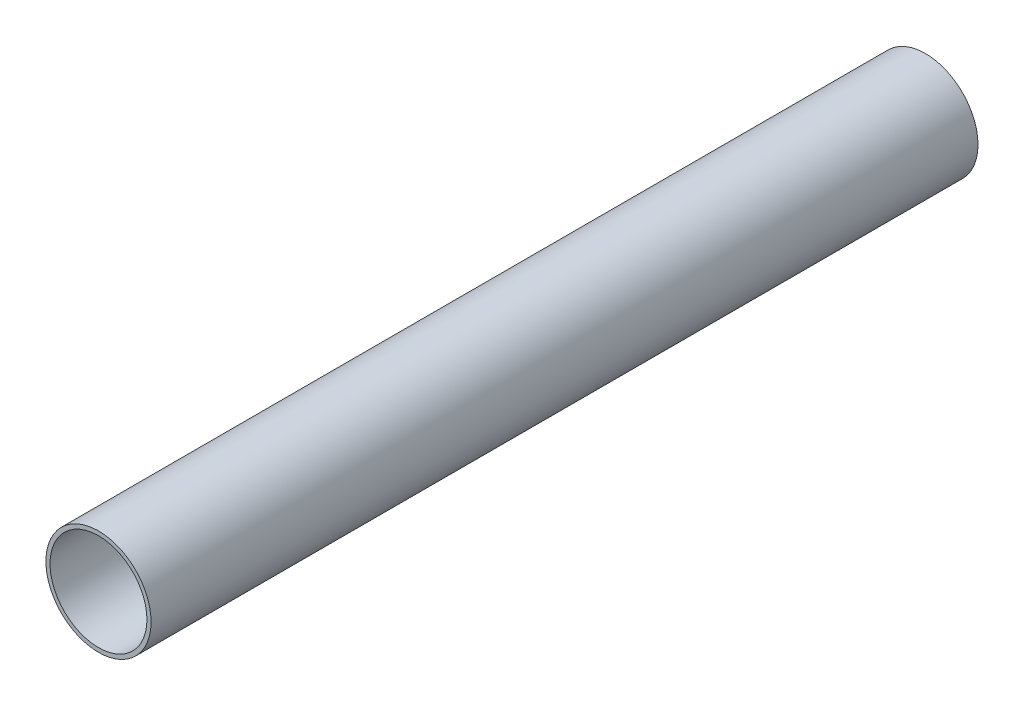
ISO-10303-21;
HEADER;
FILE_DESCRIPTION(('STEP AP214'),'2;1');
FILE_NAME('part.step','',(''),(''),'','','');
FILE_SCHEMA(('AUTOMOTIVE_DESIGN { 1 0 10303 214 1 1 1 1 }'));
ENDSEC;
DATA;
#1=APPLICATION_CONTEXT('core data for automotive mechanical design processes');
#2=APPLICATION_PROTOCOL_DEFINITION('international standard','automotive_design',2000,#1);
#3=PRODUCT_CONTEXT('',#1,'mechanical');
#4=PRODUCT('Part','Part','',(#3));
#5=PRODUCT_RELATED_PRODUCT_CATEGORY('part','',(#4));
#6=PRODUCT_DEFINITION_FORMATION('','',#4);
#7=PRODUCT_DEFINITION_CONTEXT('part definition',#1,'design');
#8=PRODUCT_DEFINITION('design','',#6,#7);
#9=PRODUCT_DEFINITION_SHAPE('','',#8);
#10=(LENGTH_UNIT() NAMED_UNIT(*) SI_UNIT(.MILLI.,.METRE.));
#11=(NAMED_UNIT(*) PLANE_ANGLE_UNIT() SI_UNIT($,.RADIAN.));
#12=(NAMED_UNIT(*) SI_UNIT($,.STERADIAN.) SOLID_ANGLE_UNIT());
#13=UNCERTAINTY_MEASURE_WITH_UNIT(LENGTH_MEASURE(1.E-05),#10,'distance_accuracy_value','');
#14=(GEOMETRIC_REPRESENTATION_CONTEXT(3) GLOBAL_UNCERTAINTY_ASSIGNED_CONTEXT((#13)) GLOBAL_UNIT_ASSIGNED_CONTEXT((#10,
#11,#12)) REPRESENTATION_CONTEXT('',''));
#15=CARTESIAN_POINT('',(0.,0.,0.));
#16=DIRECTION('',(0.,0.,1.));
#17=DIRECTION('',(1.,0.,0.));
#18=AXIS2_PLACEMENT_3D('',#15,#16,#17);
#19=CARTESIAN_POINT('',(0.,0.,-250.));
#20=DIRECTION('',(0.,0.,1.));
#21=DIRECTION('',(1.,0.,0.));
#22=AXIS2_PLACEMENT_3D('',#19,#20,#21);
#23=CYLINDRICAL_SURFACE('',#22,15.9);
#24=CARTESIAN_POINT('',(0.,0.,-250.));
#25=DIRECTION('',(0.,0.,1.));
#26=DIRECTION('',(1.,0.,0.));
#27=AXIS2_PLACEMENT_3D('',#24,#25,#26);
#28=CIRCLE('',#27,15.9);
#29=CARTESIAN_POINT('',(15.9,0.,-250.));
#30=VERTEX_POINT('',#29);
#31=EDGE_CURVE('E10',#30,#30,#28,.T.);
#32=ORIENTED_EDGE('',*,*,#31,.T.);
#33=EDGE_LOOP('',(#32));
#34=FACE_BOUND('',#33,.T.);
#35=CARTESIAN_POINT('',(0.,0.,0.));
#36=DIRECTION('',(0.,0.,1.));
#37=DIRECTION('',(1.,0.,0.));
#38=AXIS2_PLACEMENT_3D('',#35,#36,#37);
#39=CIRCLE('',#38,15.9);
#40=CARTESIAN_POINT('',(15.9,0.,0.));
#41=VERTEX_POINT('',#40);
#42=EDGE_CURVE('E44',#41,#41,#39,.T.);
#43=ORIENTED_EDGE('',*,*,#42,.F.);
#44=EDGE_LOOP('',(#43));
#45=FACE_BOUND('',#44,.T.);
#46=ADVANCED_FACE('F41',(#34,#45),#23,.T.);
#47=CARTESIAN_POINT('',(0.,0.,-250.));
#48=DIRECTION('',(0.,0.,1.));
#49=DIRECTION('',(1.,0.,0.));
#50=AXIS2_PLACEMENT_3D('',#47,#48,#49);
#51=PLANE('',#50);
#52=CARTESIAN_POINT('',(0.,0.,-250.));
#53=DIRECTION('',(0.,0.,1.));
#54=DIRECTION('',(1.,0.,0.));
#55=AXIS2_PLACEMENT_3D('',#52,#53,#54);
#56=CIRCLE('',#55,14.65);
#57=CARTESIAN_POINT('',(14.65,0.,-250.));
#58=VERTEX_POINT('',#57);
#59=EDGE_CURVE('E53',#58,#58,#56,.F.);
#60=ORIENTED_EDGE('',*,*,#59,.F.);
#61=EDGE_LOOP('',(#60));
#62=FACE_BOUND('',#61,.T.);
#63=ORIENTED_EDGE('',*,*,#31,.F.);
#64=EDGE_LOOP('',(#63));
#65=FACE_BOUND('',#64,.T.);
#66=ADVANCED_FACE('F69',(#62,#65),#51,.F.);
#67=CARTESIAN_POINT('',(0.,0.,0.));
#68=DIRECTION('',(0.,0.,1.));
#69=DIRECTION('',(1.,0.,0.));
#70=AXIS2_PLACEMENT_3D('',#67,#68,#69);
#71=PLANE('',#70);
#72=CARTESIAN_POINT('',(0.,0.,0.));
#73=DIRECTION('',(0.,0.,1.));
#74=DIRECTION('',(1.,0.,0.));
#75=AXIS2_PLACEMENT_3D('',#72,#73,#74);
#76=CIRCLE('',#75,14.65);
#77=CARTESIAN_POINT('',(14.65,0.,0.));
#78=VERTEX_POINT('',#77);
#79=EDGE_CURVE('E58',#78,#78,#76,.T.);
#80=ORIENTED_EDGE('',*,*,#79,.F.);
#81=EDGE_LOOP('',(#80));
#82=FACE_BOUND('',#81,.T.);
#83=ORIENTED_EDGE('',*,*,#42,.T.);
#84=EDGE_LOOP('',(#83));
#85=FACE_BOUND('',#84,.T.);
#86=ADVANCED_FACE('F66',(#82,#85),#71,.T.);
#87=CARTESIAN_POINT('',(0.,0.,-250.001));
#88=DIRECTION('',(0.,0.,1.));
#89=DIRECTION('',(1.,0.,0.));
#90=AXIS2_PLACEMENT_3D('',#87,#88,#89);
#91=CYLINDRICAL_SURFACE('',#90,14.65);
#92=ORIENTED_EDGE('',*,*,#79,.T.);
#93=EDGE_LOOP('',(#92));
#94=FACE_BOUND('',#93,.T.);
#95=ORIENTED_EDGE('',*,*,#59,.T.);
#96=EDGE_LOOP('',(#95));
#97=FACE_BOUND('',#96,.T.);
#98=ADVANCED_FACE('F63',(#94,#97),#91,.F.);
#99=CLOSED_SHELL('',(#46,#66,#86,#98));
#100=MANIFOLD_SOLID_BREP('B2',#99);
#101=ADVANCED_BREP_SHAPE_REPRESENTATION('',(#18,#100),#14);
#102=SHAPE_DEFINITION_REPRESENTATION(#9,#101);
ENDSEC;
END-ISO-10303-21;
